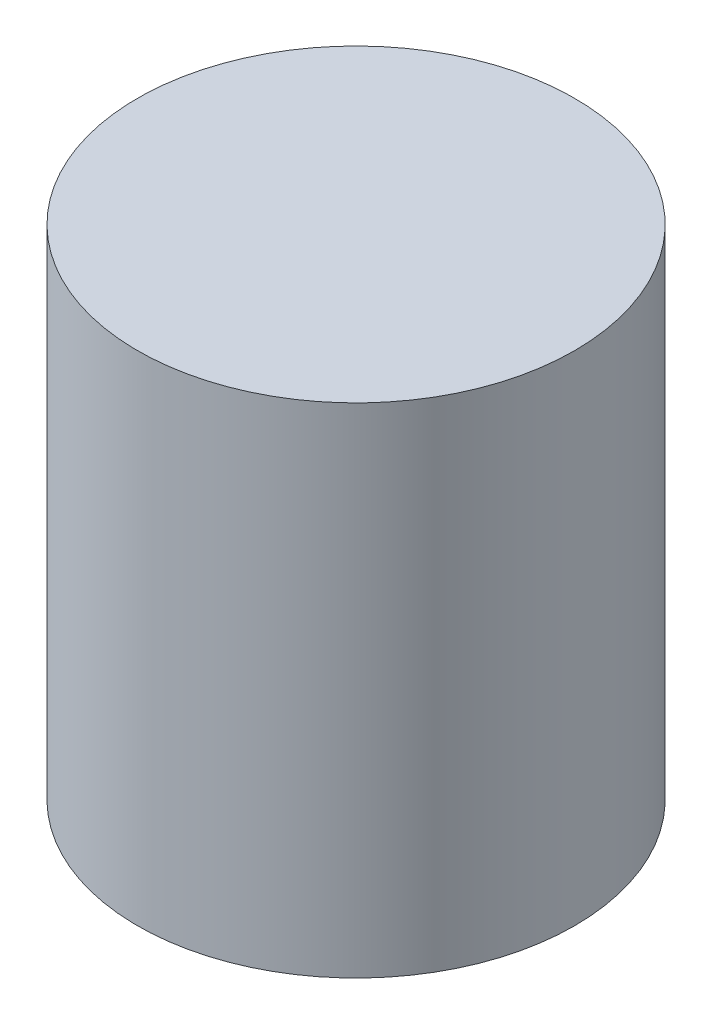
ISO-10303-21;
HEADER;
FILE_DESCRIPTION(('STEP AP214'),'2;1');
FILE_NAME('part.step','',(''),(''),'','','');
FILE_SCHEMA(('AUTOMOTIVE_DESIGN { 1 0 10303 214 1 1 1 1 }'));
ENDSEC;
DATA;
#1=APPLICATION_CONTEXT('core data for automotive mechanical design processes');
#2=APPLICATION_PROTOCOL_DEFINITION('international standard','automotive_design',2000,#1);
#3=PRODUCT_CONTEXT('',#1,'mechanical');
#4=PRODUCT('Part','Part','',(#3));
#5=PRODUCT_RELATED_PRODUCT_CATEGORY('part','',(#4));
#6=PRODUCT_DEFINITION_FORMATION('','',#4);
#7=PRODUCT_DEFINITION_CONTEXT('part definition',#1,'design');
#8=PRODUCT_DEFINITION('design','',#6,#7);
#9=PRODUCT_DEFINITION_SHAPE('','',#8);
#10=(LENGTH_UNIT() NAMED_UNIT(*) SI_UNIT(.MILLI.,.METRE.));
#11=(NAMED_UNIT(*) PLANE_ANGLE_UNIT() SI_UNIT($,.RADIAN.));
#12=(NAMED_UNIT(*) SI_UNIT($,.STERADIAN.) SOLID_ANGLE_UNIT());
#13=UNCERTAINTY_MEASURE_WITH_UNIT(LENGTH_MEASURE(1.E-05),#10,'distance_accuracy_value','');
#14=(GEOMETRIC_REPRESENTATION_CONTEXT(3) GLOBAL_UNCERTAINTY_ASSIGNED_CONTEXT((#13)) GLOBAL_UNIT_ASSIGNED_CONTEXT((#10,
#11,#12)) REPRESENTATION_CONTEXT('',''));
#15=CARTESIAN_POINT('',(0.,0.,0.));
#16=DIRECTION('',(0.,0.,1.));
#17=DIRECTION('',(1.,0.,0.));
#18=AXIS2_PLACEMENT_3D('',#15,#16,#17);
#19=CARTESIAN_POINT('',(-22.6,-14.9757163599443,0.));
#20=DIRECTION('',(0.,1.,0.));
#21=DIRECTION('',(-1.,0.,0.));
#22=AXIS2_PLACEMENT_3D('',#19,#20,#21);
#23=PLANE('',#22);
#24=CARTESIAN_POINT('',(0.,-14.9757163599442,0.));
#25=DIRECTION('',(0.,-1.,0.));
#26=DIRECTION('',(1.,0.,0.));
#27=AXIS2_PLACEMENT_3D('',#24,#25,#26);
#28=CIRCLE('',#27,22.6000000000001);
#29=CARTESIAN_POINT('',(22.6000000000001,-14.9757163599441,0.));
#30=VERTEX_POINT('',#29);
#31=EDGE_CURVE('E49',#30,#30,#28,.T.);
#32=ORIENTED_EDGE('',*,*,#31,.F.);
#33=EDGE_LOOP('',(#32));
#34=FACE_BOUND('',#33,.T.);
#35=CARTESIAN_POINT('',(0.,-14.9757163599442,0.));
#36=DIRECTION('',(0.,-1.,0.));
#37=DIRECTION('',(1.,0.,0.));
#38=AXIS2_PLACEMENT_3D('',#35,#36,#37);
#39=CIRCLE('',#38,25.1000000000001);
#40=CARTESIAN_POINT('',(25.1000000000001,-14.9757163599441,0.));
#41=VERTEX_POINT('',#40);
#42=EDGE_CURVE('E10',#41,#41,#39,.T.);
#43=ORIENTED_EDGE('',*,*,#42,.T.);
#44=EDGE_LOOP('',(#43));
#45=FACE_BOUND('',#44,.T.);
#46=ADVANCED_FACE('F35',(#34,#45),#23,.F.);
#47=CARTESIAN_POINT('',(3.23026983226829E-12,-941.701268134635,0.));
#48=DIRECTION('',(0.,-1.,0.));
#49=DIRECTION('',(1.,0.,0.));
#50=AXIS2_PLACEMENT_3D('',#47,#48,#49);
#51=CYLINDRICAL_SURFACE('',#50,25.1);
#52=ORIENTED_EDGE('',*,*,#42,.F.);
#53=EDGE_LOOP('',(#52));
#54=FACE_BOUND('',#53,.T.);
#55=CARTESIAN_POINT('',(-1.4483980668497E-13,42.2242836400558,0.));
#56=DIRECTION('',(0.,-1.,0.));
#57=DIRECTION('',(1.,0.,0.));
#58=AXIS2_PLACEMENT_3D('',#55,#56,#57);
#59=CIRCLE('',#58,25.0999999999999);
#60=CARTESIAN_POINT('',(25.0999999999997,42.2242836400559,0.));
#61=VERTEX_POINT('',#60);
#62=EDGE_CURVE('E41',#61,#61,#59,.T.);
#63=ORIENTED_EDGE('',*,*,#62,.T.);
#64=EDGE_LOOP('',(#63));
#65=FACE_BOUND('',#64,.T.);
#66=ADVANCED_FACE('F58',(#54,#65),#51,.T.);
#67=CARTESIAN_POINT('',(-25.1,42.2242836400557,0.));
#68=DIRECTION('',(0.,-1.,0.));
#69=DIRECTION('',(1.,0.,0.));
#70=AXIS2_PLACEMENT_3D('',#67,#68,#69);
#71=PLANE('',#70);
#72=ORIENTED_EDGE('',*,*,#62,.F.);
#73=EDGE_LOOP('',(#72));
#74=FACE_BOUND('',#73,.T.);
#75=ADVANCED_FACE('F62',(#74),#71,.F.);
#76=CARTESIAN_POINT('',(-22.6,39.7242836400557,0.));
#77=DIRECTION('',(0.,1.,0.));
#78=DIRECTION('',(-1.,0.,0.));
#79=AXIS2_PLACEMENT_3D('',#76,#77,#78);
#80=PLANE('',#79);
#81=CARTESIAN_POINT('',(-1.36264184187756E-13,39.7242836400559,0.));
#82=DIRECTION('',(0.,-1.,0.));
#83=DIRECTION('',(1.,0.,0.));
#84=AXIS2_PLACEMENT_3D('',#81,#82,#83);
#85=CIRCLE('',#84,22.5999999999999);
#86=CARTESIAN_POINT('',(22.5999999999997,39.7242836400559,0.));
#87=VERTEX_POINT('',#86);
#88=EDGE_CURVE('E45',#87,#87,#85,.T.);
#89=ORIENTED_EDGE('',*,*,#88,.T.);
#90=EDGE_LOOP('',(#89));
#91=FACE_BOUND('',#90,.T.);
#92=ADVANCED_FACE('F67',(#91),#80,.F.);
#93=CARTESIAN_POINT('',(3.23026983226829E-12,-941.701268134635,0.));
#94=DIRECTION('',(0.,-1.,0.));
#95=DIRECTION('',(1.,0.,0.));
#96=AXIS2_PLACEMENT_3D('',#93,#94,#95);
#97=CYLINDRICAL_SURFACE('',#96,22.6);
#98=ORIENTED_EDGE('',*,*,#88,.F.);
#99=EDGE_LOOP('',(#98));
#100=FACE_BOUND('',#99,.T.);
#101=ORIENTED_EDGE('',*,*,#31,.T.);
#102=EDGE_LOOP('',(#101));
#103=FACE_BOUND('',#102,.T.);
#104=ADVANCED_FACE('F55',(#100,#103),#97,.F.);
#105=CLOSED_SHELL('',(#46,#66,#75,#92,#104));
#106=MANIFOLD_SOLID_BREP('B2',#105);
#107=ADVANCED_BREP_SHAPE_REPRESENTATION('',(#18,#106),#14);
#108=SHAPE_DEFINITION_REPRESENTATION(#9,#107);
ENDSEC;
END-ISO-10303-21;
